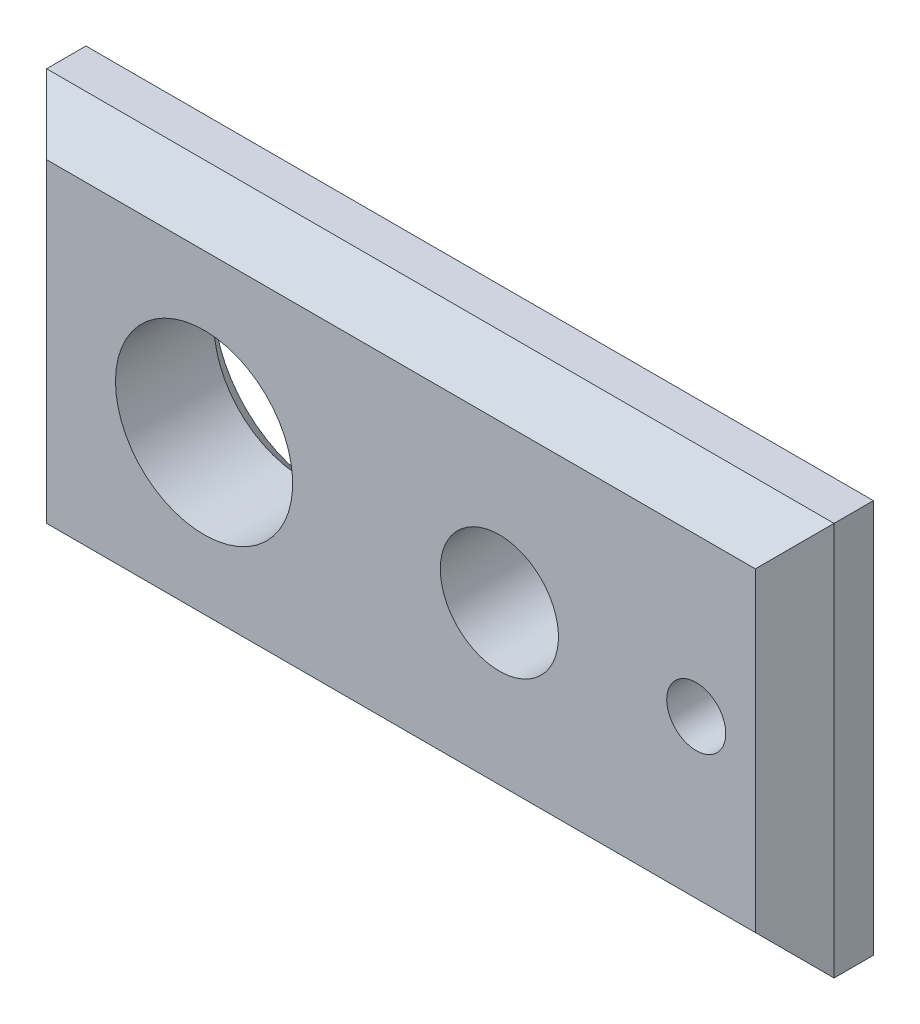
ISO-10303-21;
HEADER;
FILE_DESCRIPTION(('STEP AP214'),'2;1');
FILE_NAME('part.step','',(''),(''),'','','');
FILE_SCHEMA(('AUTOMOTIVE_DESIGN { 1 0 10303 214 1 1 1 1 }'));
ENDSEC;
DATA;
#1=APPLICATION_CONTEXT('core data for automotive mechanical design processes');
#2=APPLICATION_PROTOCOL_DEFINITION('international standard','automotive_design',2000,#1);
#3=PRODUCT_CONTEXT('',#1,'mechanical');
#4=PRODUCT('Part','Part','',(#3));
#5=PRODUCT_RELATED_PRODUCT_CATEGORY('part','',(#4));
#6=PRODUCT_DEFINITION_FORMATION('','',#4);
#7=PRODUCT_DEFINITION_CONTEXT('part definition',#1,'design');
#8=PRODUCT_DEFINITION('design','',#6,#7);
#9=PRODUCT_DEFINITION_SHAPE('','',#8);
#10=(LENGTH_UNIT() NAMED_UNIT(*) SI_UNIT(.MILLI.,.METRE.));
#11=(NAMED_UNIT(*) PLANE_ANGLE_UNIT() SI_UNIT($,.RADIAN.));
#12=(NAMED_UNIT(*) SI_UNIT($,.STERADIAN.) SOLID_ANGLE_UNIT());
#13=UNCERTAINTY_MEASURE_WITH_UNIT(LENGTH_MEASURE(1.E-05),#10,'distance_accuracy_value','');
#14=(GEOMETRIC_REPRESENTATION_CONTEXT(3) GLOBAL_UNCERTAINTY_ASSIGNED_CONTEXT((#13)) GLOBAL_UNIT_ASSIGNED_CONTEXT((#10,
#11,#12)) REPRESENTATION_CONTEXT('',''));
#15=CARTESIAN_POINT('',(0.,0.,0.));
#16=DIRECTION('',(0.,0.,1.));
#17=DIRECTION('',(1.,0.,0.));
#18=AXIS2_PLACEMENT_3D('',#15,#16,#17);
#19=CARTESIAN_POINT('',(1000.,-500.,300.));
#20=DIRECTION('',(-1.,0.,0.));
#21=DIRECTION('',(0.,-1.,0.));
#22=AXIS2_PLACEMENT_3D('',#19,#20,#21);
#23=PLANE('',#22);
#24=DIRECTION('',(0.,0.,-1.));
#25=VECTOR('',#24,1.);
#26=CARTESIAN_POINT('',(1000.,-500.,300.));
#27=LINE('',#26,#25);
#28=CARTESIAN_POINT('',(1000.,-500.,199.999999999999));
#29=VERTEX_POINT('',#28);
#30=CARTESIAN_POINT('',(1000.,-500.,100.));
#31=VERTEX_POINT('',#30);
#32=EDGE_CURVE('E116',#29,#31,#27,.T.);
#33=ORIENTED_EDGE('',*,*,#32,.T.);
#34=DIRECTION('',(0.,1.,0.));
#35=VECTOR('',#34,1.);
#36=CARTESIAN_POINT('',(1000.,500.,100.));
#37=LINE('',#36,#35);
#38=CARTESIAN_POINT('',(1000.,500.,100.));
#39=VERTEX_POINT('',#38);
#40=EDGE_CURVE('E336',#31,#39,#37,.T.);
#41=ORIENTED_EDGE('',*,*,#40,.T.);
#42=DIRECTION('',(0.,0.,-1.));
#43=VECTOR('',#42,1.);
#44=CARTESIAN_POINT('',(1000.,500.,300.));
#45=LINE('',#44,#43);
#46=CARTESIAN_POINT('',(1000.,500.,199.999999999999));
#47=VERTEX_POINT('',#46);
#48=EDGE_CURVE('E141',#47,#39,#45,.T.);
#49=ORIENTED_EDGE('',*,*,#48,.F.);
#50=DIRECTION('',(0.,-1.,0.));
#51=VECTOR('',#50,1.);
#52=CARTESIAN_POINT('',(1000.,-500.,199.999999999999));
#53=LINE('',#52,#51);
#54=EDGE_CURVE('E276',#47,#29,#53,.T.);
#55=ORIENTED_EDGE('',*,*,#54,.T.);
#56=EDGE_LOOP('',(#33,#41,#49,#55));
#57=FACE_BOUND('',#56,.T.);
#58=ADVANCED_FACE('F41',(#57),#23,.F.);
#59=CARTESIAN_POINT('',(-1000.,500.,300.));
#60=DIRECTION('',(0.,-1.,0.));
#61=DIRECTION('',(0.,0.,-1.));
#62=AXIS2_PLACEMENT_3D('',#59,#60,#61);
#63=PLANE('',#62);
#64=ORIENTED_EDGE('',*,*,#48,.T.);
#65=DIRECTION('',(-1.,0.,0.));
#66=VECTOR('',#65,1.);
#67=CARTESIAN_POINT('',(-1000.,500.,100.));
#68=LINE('',#67,#66);
#69=CARTESIAN_POINT('',(-1000.,500.,100.));
#70=VERTEX_POINT('',#69);
#71=EDGE_CURVE('E285',#39,#70,#68,.T.);
#72=ORIENTED_EDGE('',*,*,#71,.T.);
#73=DIRECTION('',(0.,0.,-1.));
#74=VECTOR('',#73,1.);
#75=CARTESIAN_POINT('',(-1000.,500.,300.));
#76=LINE('',#75,#74);
#77=CARTESIAN_POINT('',(-1000.,500.,199.999999999999));
#78=VERTEX_POINT('',#77);
#79=EDGE_CURVE('E134',#78,#70,#76,.T.);
#80=ORIENTED_EDGE('',*,*,#79,.F.);
#81=DIRECTION('',(1.,0.,0.));
#82=VECTOR('',#81,1.);
#83=CARTESIAN_POINT('',(-1000.,500.,199.999999999999));
#84=LINE('',#83,#82);
#85=EDGE_CURVE('E339',#78,#47,#84,.T.);
#86=ORIENTED_EDGE('',*,*,#85,.T.);
#87=EDGE_LOOP('',(#64,#72,#80,#86));
#88=FACE_BOUND('',#87,.T.);
#89=ADVANCED_FACE('F203',(#88),#63,.F.);
#90=CARTESIAN_POINT('',(-1000.,-500.,300.));
#91=DIRECTION('',(1.,0.,0.));
#92=DIRECTION('',(0.,1.,0.));
#93=AXIS2_PLACEMENT_3D('',#90,#91,#92);
#94=PLANE('',#93);
#95=ORIENTED_EDGE('',*,*,#79,.T.);
#96=DIRECTION('',(0.,-1.,0.));
#97=VECTOR('',#96,1.);
#98=CARTESIAN_POINT('',(-1000.,-500.,100.));
#99=LINE('',#98,#97);
#100=CARTESIAN_POINT('',(-1000.,-500.,100.));
#101=VERTEX_POINT('',#100);
#102=EDGE_CURVE('E132',#70,#101,#99,.T.);
#103=ORIENTED_EDGE('',*,*,#102,.T.);
#104=DIRECTION('',(0.,0.,-1.));
#105=VECTOR('',#104,1.);
#106=CARTESIAN_POINT('',(-1000.,-500.,300.));
#107=LINE('',#106,#105);
#108=CARTESIAN_POINT('',(-1000.,-500.,199.999999999999));
#109=VERTEX_POINT('',#108);
#110=EDGE_CURVE('E114',#109,#101,#107,.T.);
#111=ORIENTED_EDGE('',*,*,#110,.F.);
#112=DIRECTION('',(0.,1.,0.));
#113=VECTOR('',#112,1.);
#114=CARTESIAN_POINT('',(-1000.,-500.,199.999999999999));
#115=LINE('',#114,#113);
#116=EDGE_CURVE('E129',#109,#78,#115,.T.);
#117=ORIENTED_EDGE('',*,*,#116,.T.);
#118=EDGE_LOOP('',(#95,#103,#111,#117));
#119=FACE_BOUND('',#118,.T.);
#120=ADVANCED_FACE('F128',(#119),#94,.F.);
#121=CARTESIAN_POINT('',(-1000.,-500.,300.));
#122=DIRECTION('',(0.,1.,0.));
#123=DIRECTION('',(0.,0.,1.));
#124=AXIS2_PLACEMENT_3D('',#121,#122,#123);
#125=PLANE('',#124);
#126=ORIENTED_EDGE('',*,*,#110,.T.);
#127=DIRECTION('',(1.,0.,0.));
#128=VECTOR('',#127,1.);
#129=CARTESIAN_POINT('',(1000.,-500.,100.));
#130=LINE('',#129,#128);
#131=EDGE_CURVE('E121',#101,#31,#130,.T.);
#132=ORIENTED_EDGE('',*,*,#131,.T.);
#133=ORIENTED_EDGE('',*,*,#32,.F.);
#134=DIRECTION('',(-1.,0.,0.));
#135=VECTOR('',#134,1.);
#136=CARTESIAN_POINT('',(-1000.,-500.,199.999999999999));
#137=LINE('',#136,#135);
#138=EDGE_CURVE('E111',#29,#109,#137,.T.);
#139=ORIENTED_EDGE('',*,*,#138,.T.);
#140=EDGE_LOOP('',(#126,#132,#133,#139));
#141=FACE_BOUND('',#140,.T.);
#142=ADVANCED_FACE('F113',(#141),#125,.F.);
#143=CARTESIAN_POINT('',(0.,0.,300.));
#144=DIRECTION('',(0.,0.,-1.));
#145=DIRECTION('',(-1.,0.,0.));
#146=AXIS2_PLACEMENT_3D('',#143,#144,#145);
#147=PLANE('',#146);
#148=CARTESIAN_POINT('',(750.,-1.11022302462516E-13,300.));
#149=DIRECTION('',(0.,0.,-1.));
#150=DIRECTION('',(-1.,0.,0.));
#151=AXIS2_PLACEMENT_3D('',#148,#149,#150);
#152=CIRCLE('',#151,74.9999999999999);
#153=CARTESIAN_POINT('',(675.,-1.11022302462516E-13,300.));
#154=VERTEX_POINT('',#153);
#155=EDGE_CURVE('E145',#154,#154,#152,.T.);
#156=ORIENTED_EDGE('',*,*,#155,.T.);
#157=EDGE_LOOP('',(#156));
#158=FACE_BOUND('',#157,.T.);
#159=CARTESIAN_POINT('',(250.,0.,300.));
#160=DIRECTION('',(0.,0.,-1.));
#161=DIRECTION('',(-1.,0.,0.));
#162=AXIS2_PLACEMENT_3D('',#159,#160,#161);
#163=CIRCLE('',#162,150.);
#164=CARTESIAN_POINT('',(99.9999999999999,0.,300.));
#165=VERTEX_POINT('',#164);
#166=EDGE_CURVE('E152',#165,#165,#163,.T.);
#167=ORIENTED_EDGE('',*,*,#166,.T.);
#168=EDGE_LOOP('',(#167));
#169=FACE_BOUND('',#168,.T.);
#170=CARTESIAN_POINT('',(-500.,0.,300.));
#171=DIRECTION('',(0.,0.,-1.));
#172=DIRECTION('',(-1.,0.,0.));
#173=AXIS2_PLACEMENT_3D('',#170,#171,#172);
#174=CIRCLE('',#173,225.);
#175=CARTESIAN_POINT('',(-725.,0.,300.));
#176=VERTEX_POINT('',#175);
#177=EDGE_CURVE('E310',#176,#176,#174,.T.);
#178=ORIENTED_EDGE('',*,*,#177,.T.);
#179=EDGE_LOOP('',(#178));
#180=FACE_BOUND('',#179,.T.);
#181=DIRECTION('',(-1.,0.,0.));
#182=VECTOR('',#181,1.);
#183=CARTESIAN_POINT('',(0.,400.,300.));
#184=LINE('',#183,#182);
#185=CARTESIAN_POINT('',(900.,400.,300.));
#186=VERTEX_POINT('',#185);
#187=CARTESIAN_POINT('',(-900.,400.,300.));
#188=VERTEX_POINT('',#187);
#189=EDGE_CURVE('E280',#186,#188,#184,.T.);
#190=ORIENTED_EDGE('',*,*,#189,.T.);
#191=DIRECTION('',(0.,-1.,0.));
#192=VECTOR('',#191,1.);
#193=CARTESIAN_POINT('',(-900.,0.,300.));
#194=LINE('',#193,#192);
#195=CARTESIAN_POINT('',(-900.,-400.,300.));
#196=VERTEX_POINT('',#195);
#197=EDGE_CURVE('E170',#188,#196,#194,.T.);
#198=ORIENTED_EDGE('',*,*,#197,.T.);
#199=DIRECTION('',(1.,0.,0.));
#200=VECTOR('',#199,1.);
#201=CARTESIAN_POINT('',(0.,-400.,300.));
#202=LINE('',#201,#200);
#203=CARTESIAN_POINT('',(900.,-400.,300.));
#204=VERTEX_POINT('',#203);
#205=EDGE_CURVE('E65',#196,#204,#202,.T.);
#206=ORIENTED_EDGE('',*,*,#205,.T.);
#207=DIRECTION('',(0.,1.,0.));
#208=VECTOR('',#207,1.);
#209=CARTESIAN_POINT('',(900.,0.,300.));
#210=LINE('',#209,#208);
#211=EDGE_CURVE('E277',#204,#186,#210,.T.);
#212=ORIENTED_EDGE('',*,*,#211,.T.);
#213=EDGE_LOOP('',(#190,#198,#206,#212));
#214=FACE_BOUND('',#213,.T.);
#215=ADVANCED_FACE('F349',(#158,#169,#180,#214),#147,.F.);
#216=CARTESIAN_POINT('',(0.,0.,0.));
#217=DIRECTION('',(0.,0.,-1.));
#218=DIRECTION('',(-1.,0.,0.));
#219=AXIS2_PLACEMENT_3D('',#216,#217,#218);
#220=PLANE('',#219);
#221=CARTESIAN_POINT('',(250.,0.,0.));
#222=DIRECTION('',(0.,0.,-1.));
#223=DIRECTION('',(-1.,0.,0.));
#224=AXIS2_PLACEMENT_3D('',#221,#222,#223);
#225=CIRCLE('',#224,200.000000000001);
#226=CARTESIAN_POINT('',(49.9999999999993,0.,0.));
#227=VERTEX_POINT('',#226);
#228=EDGE_CURVE('E178',#227,#227,#225,.F.);
#229=ORIENTED_EDGE('',*,*,#228,.T.);
#230=EDGE_LOOP('',(#229));
#231=FACE_BOUND('',#230,.T.);
#232=CARTESIAN_POINT('',(-500.,0.,0.));
#233=DIRECTION('',(0.,0.,-1.));
#234=DIRECTION('',(-1.,0.,0.));
#235=AXIS2_PLACEMENT_3D('',#232,#233,#234);
#236=CIRCLE('',#235,275.000000000001);
#237=CARTESIAN_POINT('',(-775.000000000001,0.,0.));
#238=VERTEX_POINT('',#237);
#239=EDGE_CURVE('E174',#238,#238,#236,.F.);
#240=ORIENTED_EDGE('',*,*,#239,.T.);
#241=EDGE_LOOP('',(#240));
#242=FACE_BOUND('',#241,.T.);
#243=CARTESIAN_POINT('',(750.,-1.11022302462516E-13,0.));
#244=DIRECTION('',(0.,0.,-1.));
#245=DIRECTION('',(-1.,0.,0.));
#246=AXIS2_PLACEMENT_3D('',#243,#244,#245);
#247=CIRCLE('',#246,125.);
#248=CARTESIAN_POINT('',(625.,-1.11022302462516E-13,0.));
#249=VERTEX_POINT('',#248);
#250=EDGE_CURVE('E169',#249,#249,#247,.F.);
#251=ORIENTED_EDGE('',*,*,#250,.T.);
#252=EDGE_LOOP('',(#251));
#253=FACE_BOUND('',#252,.T.);
#254=DIRECTION('',(-1.,0.,0.));
#255=VECTOR('',#254,1.);
#256=CARTESIAN_POINT('',(-1000.,-399.999999999999,0.));
#257=LINE('',#256,#255);
#258=CARTESIAN_POINT('',(899.999999999999,-399.999999999999,0.));
#259=VERTEX_POINT('',#258);
#260=CARTESIAN_POINT('',(-899.999999999999,-399.999999999999,0.));
#261=VERTEX_POINT('',#260);
#262=EDGE_CURVE('E326',#259,#261,#257,.T.);
#263=ORIENTED_EDGE('',*,*,#262,.T.);
#264=DIRECTION('',(0.,1.,0.));
#265=VECTOR('',#264,1.);
#266=CARTESIAN_POINT('',(-899.999999999999,500.,0.));
#267=LINE('',#266,#265);
#268=CARTESIAN_POINT('',(-899.999999999999,399.999999999999,0.));
#269=VERTEX_POINT('',#268);
#270=EDGE_CURVE('E122',#261,#269,#267,.T.);
#271=ORIENTED_EDGE('',*,*,#270,.T.);
#272=DIRECTION('',(1.,0.,0.));
#273=VECTOR('',#272,1.);
#274=CARTESIAN_POINT('',(1000.,399.999999999999,0.));
#275=LINE('',#274,#273);
#276=CARTESIAN_POINT('',(899.999999999999,399.999999999999,0.));
#277=VERTEX_POINT('',#276);
#278=EDGE_CURVE('E320',#269,#277,#275,.T.);
#279=ORIENTED_EDGE('',*,*,#278,.T.);
#280=DIRECTION('',(0.,-1.,0.));
#281=VECTOR('',#280,1.);
#282=CARTESIAN_POINT('',(899.999999999999,-500.,0.));
#283=LINE('',#282,#281);
#284=EDGE_CURVE('E323',#277,#259,#283,.T.);
#285=ORIENTED_EDGE('',*,*,#284,.T.);
#286=EDGE_LOOP('',(#263,#271,#279,#285));
#287=FACE_BOUND('',#286,.T.);
#288=ADVANCED_FACE('F242',(#231,#242,#253,#287),#220,.T.);
#289=CARTESIAN_POINT('',(1000.,-500.,100.));
#290=DIRECTION('',(0.707106781186546,0.,-0.707106781186549));
#291=DIRECTION('',(0.,-1.,0.));
#292=AXIS2_PLACEMENT_3D('',#289,#290,#291);
#293=PLANE('',#292);
#294=DIRECTION('',(-0.577350269189626,0.577350269189627,-0.577350269189624));
#295=VECTOR('',#294,1.);
#296=CARTESIAN_POINT('',(1000.,-500.,100.));
#297=LINE('',#296,#295);
#298=EDGE_CURVE('E295',#259,#31,#297,.F.);
#299=ORIENTED_EDGE('',*,*,#298,.F.);
#300=ORIENTED_EDGE('',*,*,#284,.F.);
#301=DIRECTION('',(-0.577350269189626,-0.577350269189627,-0.577350269189623));
#302=VECTOR('',#301,1.);
#303=CARTESIAN_POINT('',(333.333333333332,-166.666666666669,-566.666666666665));
#304=LINE('',#303,#302);
#305=EDGE_CURVE('E155',#39,#277,#304,.T.);
#306=ORIENTED_EDGE('',*,*,#305,.F.);
#307=ORIENTED_EDGE('',*,*,#40,.F.);
#308=EDGE_LOOP('',(#299,#300,#306,#307));
#309=FACE_BOUND('',#308,.T.);
#310=ADVANCED_FACE('F236',(#309),#293,.T.);
#311=CARTESIAN_POINT('',(-1000.,500.,100.));
#312=DIRECTION('',(0.,0.707106781186545,-0.70710678118655));
#313=DIRECTION('',(1.,0.,0.));
#314=AXIS2_PLACEMENT_3D('',#311,#312,#313);
#315=PLANE('',#314);
#316=ORIENTED_EDGE('',*,*,#305,.T.);
#317=ORIENTED_EDGE('',*,*,#278,.F.);
#318=DIRECTION('',(-0.577350269189627,0.577350269189627,0.577350269189623));
#319=VECTOR('',#318,1.);
#320=CARTESIAN_POINT('',(-1000.,500.,100.));
#321=LINE('',#320,#319);
#322=EDGE_CURVE('E293',#70,#269,#321,.F.);
#323=ORIENTED_EDGE('',*,*,#322,.F.);
#324=ORIENTED_EDGE('',*,*,#71,.F.);
#325=EDGE_LOOP('',(#316,#317,#323,#324));
#326=FACE_BOUND('',#325,.T.);
#327=ADVANCED_FACE('F229',(#326),#315,.T.);
#328=CARTESIAN_POINT('',(-1000.,-500.,100.));
#329=DIRECTION('',(0.,-0.707106781186545,-0.70710678118655));
#330=DIRECTION('',(-1.,0.,0.));
#331=AXIS2_PLACEMENT_3D('',#328,#329,#330);
#332=PLANE('',#331);
#333=ORIENTED_EDGE('',*,*,#298,.T.);
#334=ORIENTED_EDGE('',*,*,#131,.F.);
#335=DIRECTION('',(0.577350269189627,0.577350269189627,-0.577350269189623));
#336=VECTOR('',#335,1.);
#337=CARTESIAN_POINT('',(-1000.,-500.,100.));
#338=LINE('',#337,#336);
#339=EDGE_CURVE('E164',#261,#101,#338,.F.);
#340=ORIENTED_EDGE('',*,*,#339,.F.);
#341=ORIENTED_EDGE('',*,*,#262,.F.);
#342=EDGE_LOOP('',(#333,#334,#340,#341));
#343=FACE_BOUND('',#342,.T.);
#344=ADVANCED_FACE('F222',(#343),#332,.T.);
#345=CARTESIAN_POINT('',(-1000.,-500.,100.));
#346=DIRECTION('',(-0.707106781186545,0.,-0.70710678118655));
#347=DIRECTION('',(0.,1.,0.));
#348=AXIS2_PLACEMENT_3D('',#345,#346,#347);
#349=PLANE('',#348);
#350=ORIENTED_EDGE('',*,*,#322,.T.);
#351=ORIENTED_EDGE('',*,*,#270,.F.);
#352=ORIENTED_EDGE('',*,*,#339,.T.);
#353=ORIENTED_EDGE('',*,*,#102,.F.);
#354=EDGE_LOOP('',(#350,#351,#352,#353));
#355=FACE_BOUND('',#354,.T.);
#356=ADVANCED_FACE('F214',(#355),#349,.T.);
#357=CARTESIAN_POINT('',(900.,0.,300.));
#358=DIRECTION('',(-0.70710678118655,0.,-0.707106781186545));
#359=DIRECTION('',(0.,1.,0.));
#360=AXIS2_PLACEMENT_3D('',#357,#358,#359);
#361=PLANE('',#360);
#362=DIRECTION('',(0.577350269189624,-0.577350269189625,-0.577350269189628));
#363=VECTOR('',#362,1.);
#364=CARTESIAN_POINT('',(766.666666666667,-266.666666666667,433.333333333334));
#365=LINE('',#364,#363);
#366=EDGE_CURVE('E149',#29,#204,#365,.F.);
#367=ORIENTED_EDGE('',*,*,#366,.F.);
#368=ORIENTED_EDGE('',*,*,#54,.F.);
#369=DIRECTION('',(0.577350269189624,0.577350269189625,-0.577350269189628));
#370=VECTOR('',#369,1.);
#371=CARTESIAN_POINT('',(600.000000000001,100.000000000001,600.));
#372=LINE('',#371,#370);
#373=EDGE_CURVE('E160',#186,#47,#372,.T.);
#374=ORIENTED_EDGE('',*,*,#373,.F.);
#375=ORIENTED_EDGE('',*,*,#211,.F.);
#376=EDGE_LOOP('',(#367,#368,#374,#375));
#377=FACE_BOUND('',#376,.T.);
#378=ADVANCED_FACE('F221',(#377),#361,.F.);
#379=CARTESIAN_POINT('',(0.,400.,300.));
#380=DIRECTION('',(0.,-0.707106781186549,-0.707106781186546));
#381=DIRECTION('',(-1.,0.,0.));
#382=AXIS2_PLACEMENT_3D('',#379,#380,#381);
#383=PLANE('',#382);
#384=ORIENTED_EDGE('',*,*,#373,.T.);
#385=ORIENTED_EDGE('',*,*,#85,.F.);
#386=DIRECTION('',(0.577350269189625,-0.577350269189625,0.577350269189627));
#387=VECTOR('',#386,1.);
#388=CARTESIAN_POINT('',(-600.000000000001,100.000000000001,600.));
#389=LINE('',#388,#387);
#390=EDGE_CURVE('E138',#188,#78,#389,.F.);
#391=ORIENTED_EDGE('',*,*,#390,.F.);
#392=ORIENTED_EDGE('',*,*,#189,.F.);
#393=EDGE_LOOP('',(#384,#385,#391,#392));
#394=FACE_BOUND('',#393,.T.);
#395=ADVANCED_FACE('F256',(#394),#383,.F.);
#396=CARTESIAN_POINT('',(0.,-400.,300.));
#397=DIRECTION('',(0.,0.707106781186549,-0.707106781186546));
#398=DIRECTION('',(1.,0.,0.));
#399=AXIS2_PLACEMENT_3D('',#396,#397,#398);
#400=PLANE('',#399);
#401=ORIENTED_EDGE('',*,*,#366,.T.);
#402=ORIENTED_EDGE('',*,*,#205,.F.);
#403=DIRECTION('',(-0.577350269189625,-0.577350269189625,-0.577350269189627));
#404=VECTOR('',#403,1.);
#405=CARTESIAN_POINT('',(-600.,-100.000000000001,600.000000000001));
#406=LINE('',#405,#404);
#407=EDGE_CURVE('E58',#109,#196,#406,.F.);
#408=ORIENTED_EDGE('',*,*,#407,.F.);
#409=ORIENTED_EDGE('',*,*,#138,.F.);
#410=EDGE_LOOP('',(#401,#402,#408,#409));
#411=FACE_BOUND('',#410,.T.);
#412=ADVANCED_FACE('F143',(#411),#400,.F.);
#413=CARTESIAN_POINT('',(-900.,0.,300.));
#414=DIRECTION('',(0.707106781186549,0.,-0.707106781186546));
#415=DIRECTION('',(0.,-1.,0.));
#416=AXIS2_PLACEMENT_3D('',#413,#414,#415);
#417=PLANE('',#416);
#418=ORIENTED_EDGE('',*,*,#390,.T.);
#419=ORIENTED_EDGE('',*,*,#116,.F.);
#420=ORIENTED_EDGE('',*,*,#407,.T.);
#421=ORIENTED_EDGE('',*,*,#197,.F.);
#422=EDGE_LOOP('',(#418,#419,#420,#421));
#423=FACE_BOUND('',#422,.T.);
#424=ADVANCED_FACE('F136',(#423),#417,.F.);
#425=CARTESIAN_POINT('',(-500.,0.,300.));
#426=DIRECTION('',(0.,0.,-1.));
#427=DIRECTION('',(-1.,0.,0.));
#428=AXIS2_PLACEMENT_3D('',#425,#426,#427);
#429=CYLINDRICAL_SURFACE('',#428,225.);
#430=CARTESIAN_POINT('',(-500.,0.,50.0000000000007));
#431=DIRECTION('',(0.,0.,-1.));
#432=DIRECTION('',(-1.,0.,0.));
#433=AXIS2_PLACEMENT_3D('',#430,#431,#432);
#434=CIRCLE('',#433,225.);
#435=CARTESIAN_POINT('',(-725.,0.,50.0000000000007));
#436=VERTEX_POINT('',#435);
#437=EDGE_CURVE('E51',#436,#436,#434,.T.);
#438=ORIENTED_EDGE('',*,*,#437,.T.);
#439=EDGE_LOOP('',(#438));
#440=FACE_BOUND('',#439,.T.);
#441=ORIENTED_EDGE('',*,*,#177,.F.);
#442=EDGE_LOOP('',(#441));
#443=FACE_BOUND('',#442,.T.);
#444=ADVANCED_FACE('F185',(#440,#443),#429,.F.);
#445=CARTESIAN_POINT('',(250.,0.,300.));
#446=DIRECTION('',(0.,0.,-1.));
#447=DIRECTION('',(-1.,0.,0.));
#448=AXIS2_PLACEMENT_3D('',#445,#446,#447);
#449=CYLINDRICAL_SURFACE('',#448,150.);
#450=CARTESIAN_POINT('',(250.,0.,50.0000000000002));
#451=DIRECTION('',(0.,0.,-1.));
#452=DIRECTION('',(-1.,0.,0.));
#453=AXIS2_PLACEMENT_3D('',#450,#451,#452);
#454=CIRCLE('',#453,150.);
#455=CARTESIAN_POINT('',(99.9999999999999,0.,50.0000000000002));
#456=VERTEX_POINT('',#455);
#457=EDGE_CURVE('E165',#456,#456,#454,.T.);
#458=ORIENTED_EDGE('',*,*,#457,.T.);
#459=EDGE_LOOP('',(#458));
#460=FACE_BOUND('',#459,.T.);
#461=ORIENTED_EDGE('',*,*,#166,.F.);
#462=EDGE_LOOP('',(#461));
#463=FACE_BOUND('',#462,.T.);
#464=ADVANCED_FACE('F393',(#460,#463),#449,.F.);
#465=CARTESIAN_POINT('',(750.,-1.11022302462516E-13,300.));
#466=DIRECTION('',(0.,0.,-1.));
#467=DIRECTION('',(-1.,0.,0.));
#468=AXIS2_PLACEMENT_3D('',#465,#466,#467);
#469=CYLINDRICAL_SURFACE('',#468,74.9999999999999);
#470=CARTESIAN_POINT('',(750.,-1.11022302462516E-13,50.0000000000001));
#471=DIRECTION('',(0.,0.,-1.));
#472=DIRECTION('',(-1.,0.,0.));
#473=AXIS2_PLACEMENT_3D('',#470,#471,#472);
#474=CIRCLE('',#473,74.9999999999999);
#475=CARTESIAN_POINT('',(675.,-1.11022302462516E-13,50.0000000000001));
#476=VERTEX_POINT('',#475);
#477=EDGE_CURVE('E11',#476,#476,#474,.T.);
#478=ORIENTED_EDGE('',*,*,#477,.T.);
#479=EDGE_LOOP('',(#478));
#480=FACE_BOUND('',#479,.T.);
#481=ORIENTED_EDGE('',*,*,#155,.F.);
#482=EDGE_LOOP('',(#481));
#483=FACE_BOUND('',#482,.T.);
#484=ADVANCED_FACE('F197',(#480,#483),#469,.F.);
#485=CARTESIAN_POINT('',(250.,0.,50.0000000000002));
#486=DIRECTION('',(0.,0.,-1.));
#487=DIRECTION('',(-1.,0.,0.));
#488=AXIS2_PLACEMENT_3D('',#485,#486,#487);
#489=CONICAL_SURFACE('',#488,150.,0.785398163397452);
#490=ORIENTED_EDGE('',*,*,#228,.F.);
#491=EDGE_LOOP('',(#490));
#492=FACE_BOUND('',#491,.T.);
#493=ORIENTED_EDGE('',*,*,#457,.F.);
#494=EDGE_LOOP('',(#493));
#495=FACE_BOUND('',#494,.T.);
#496=ADVANCED_FACE('F190',(#492,#495),#489,.F.);
#497=CARTESIAN_POINT('',(-500.,0.,50.0000000000007));
#498=DIRECTION('',(0.,0.,-1.));
#499=DIRECTION('',(-1.,0.,0.));
#500=AXIS2_PLACEMENT_3D('',#497,#498,#499);
#501=CONICAL_SURFACE('',#500,225.,0.785398163397452);
#502=ORIENTED_EDGE('',*,*,#239,.F.);
#503=EDGE_LOOP('',(#502));
#504=FACE_BOUND('',#503,.T.);
#505=ORIENTED_EDGE('',*,*,#437,.F.);
#506=EDGE_LOOP('',(#505));
#507=FACE_BOUND('',#506,.T.);
#508=ADVANCED_FACE('F188',(#504,#507),#501,.F.);
#509=CARTESIAN_POINT('',(750.,-1.11022302462516E-13,50.0000000000001));
#510=DIRECTION('',(0.,0.,-1.));
#511=DIRECTION('',(-1.,0.,0.));
#512=AXIS2_PLACEMENT_3D('',#509,#510,#511);
#513=CONICAL_SURFACE('',#512,74.9999999999999,0.785398163397451);
#514=ORIENTED_EDGE('',*,*,#250,.F.);
#515=EDGE_LOOP('',(#514));
#516=FACE_BOUND('',#515,.T.);
#517=ORIENTED_EDGE('',*,*,#477,.F.);
#518=EDGE_LOOP('',(#517));
#519=FACE_BOUND('',#518,.T.);
#520=ADVANCED_FACE('F44',(#516,#519),#513,.F.);
#521=CLOSED_SHELL('',(#58,#89,#120,#142,#215,#288,#310,#327,#344,#356,#378,#395,#412,#424,#444,
#464,#484,#496,#508,#520));
#522=MANIFOLD_SOLID_BREP('B2',#521);
#523=ADVANCED_BREP_SHAPE_REPRESENTATION('',(#18,#522),#14);
#524=SHAPE_DEFINITION_REPRESENTATION(#9,#523);
ENDSEC;
END-ISO-10303-21;
